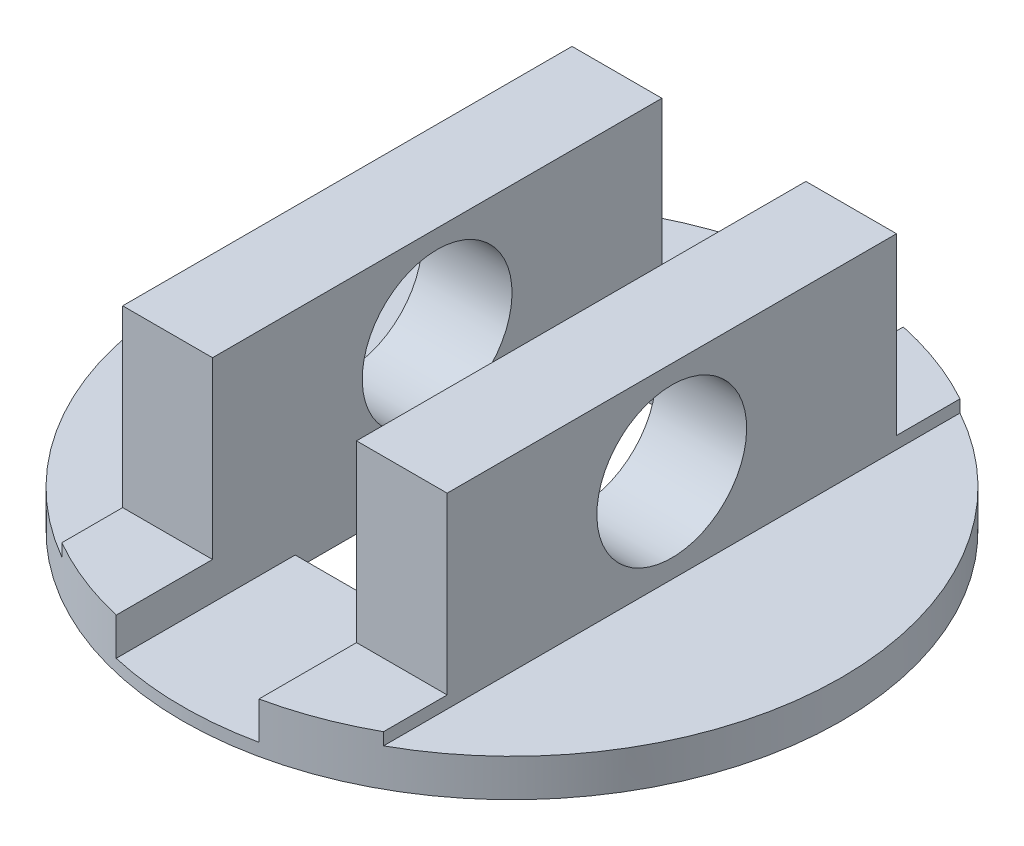
ISO-10303-21;
HEADER;
FILE_DESCRIPTION(('STEP AP214'),'2;1');
FILE_NAME('part.step','',(''),(''),'','','');
FILE_SCHEMA(('AUTOMOTIVE_DESIGN { 1 0 10303 214 1 1 1 1 }'));
ENDSEC;
DATA;
#1=APPLICATION_CONTEXT('core data for automotive mechanical design processes');
#2=APPLICATION_PROTOCOL_DEFINITION('international standard','automotive_design',2000,#1);
#3=PRODUCT_CONTEXT('',#1,'mechanical');
#4=PRODUCT('Part','Part','',(#3));
#5=PRODUCT_RELATED_PRODUCT_CATEGORY('part','',(#4));
#6=PRODUCT_DEFINITION_FORMATION('','',#4);
#7=PRODUCT_DEFINITION_CONTEXT('part definition',#1,'design');
#8=PRODUCT_DEFINITION('design','',#6,#7);
#9=PRODUCT_DEFINITION_SHAPE('','',#8);
#10=(LENGTH_UNIT() NAMED_UNIT(*) SI_UNIT(.MILLI.,.METRE.));
#11=(NAMED_UNIT(*) PLANE_ANGLE_UNIT() SI_UNIT($,.RADIAN.));
#12=(NAMED_UNIT(*) SI_UNIT($,.STERADIAN.) SOLID_ANGLE_UNIT());
#13=UNCERTAINTY_MEASURE_WITH_UNIT(LENGTH_MEASURE(1.E-05),#10,'distance_accuracy_value','');
#14=(GEOMETRIC_REPRESENTATION_CONTEXT(3) GLOBAL_UNCERTAINTY_ASSIGNED_CONTEXT((#13)) GLOBAL_UNIT_ASSIGNED_CONTEXT((#10,
#11,#12)) REPRESENTATION_CONTEXT('',''));
#15=CARTESIAN_POINT('',(0.,0.,0.));
#16=DIRECTION('',(0.,0.,1.));
#17=DIRECTION('',(1.,0.,0.));
#18=AXIS2_PLACEMENT_3D('',#15,#16,#17);
#19=CARTESIAN_POINT('',(0.,90.,0.));
#20=DIRECTION('',(0.,-1.,0.));
#21=DIRECTION('',(0.,0.,-1.));
#22=AXIS2_PLACEMENT_3D('',#19,#20,#21);
#23=CYLINDRICAL_SURFACE('',#22,132.);
#24=CARTESIAN_POINT('',(0.,0.,0.));
#25=DIRECTION('',(0.,1.,0.));
#26=DIRECTION('',(0.,0.,1.));
#27=AXIS2_PLACEMENT_3D('',#24,#25,#26);
#28=CIRCLE('',#27,132.);
#29=CARTESIAN_POINT('',(0.,0.,132.));
#30=VERTEX_POINT('',#29);
#31=EDGE_CURVE('E329',#30,#30,#28,.T.);
#32=ORIENTED_EDGE('',*,*,#31,.T.);
#33=EDGE_LOOP('',(#32));
#34=FACE_BOUND('',#33,.T.);
#35=CARTESIAN_POINT('',(0.,20.,0.));
#36=DIRECTION('',(0.,1.,0.));
#37=DIRECTION('',(0.,0.,1.));
#38=AXIS2_PLACEMENT_3D('',#35,#36,#37);
#39=CIRCLE('',#38,132.);
#40=CARTESIAN_POINT('',(27.6794161373158,20.,129.065293252281));
#41=VERTEX_POINT('',#40);
#42=CARTESIAN_POINT('',(63.9820484445118,20.,115.45690744535));
#43=VERTEX_POINT('',#42);
#44=EDGE_CURVE('E225',#41,#43,#39,.T.);
#45=ORIENTED_EDGE('',*,*,#44,.F.);
#46=DIRECTION('',(0.,-1.,0.));
#47=VECTOR('',#46,1.);
#48=CARTESIAN_POINT('',(27.6794161373158,90.,129.065293252281));
#49=LINE('',#48,#47);
#50=CARTESIAN_POINT('',(27.6794161373158,5.00000000000002,129.065293252281));
#51=VERTEX_POINT('',#50);
#52=EDGE_CURVE('E343',#51,#41,#49,.F.);
#53=ORIENTED_EDGE('',*,*,#52,.F.);
#54=CARTESIAN_POINT('',(0.,5.00000000000002,0.));
#55=DIRECTION('',(0.,-1.,0.));
#56=DIRECTION('',(0.,0.,-1.));
#57=AXIS2_PLACEMENT_3D('',#54,#55,#56);
#58=CIRCLE('',#57,132.);
#59=CARTESIAN_POINT('',(-30.,5.00000000000002,128.545711713771));
#60=VERTEX_POINT('',#59);
#61=EDGE_CURVE('E316',#51,#60,#58,.T.);
#62=ORIENTED_EDGE('',*,*,#61,.T.);
#63=DIRECTION('',(0.,-1.,0.));
#64=VECTOR('',#63,1.);
#65=CARTESIAN_POINT('',(-30.,90.,128.545711713771));
#66=LINE('',#65,#64);
#67=CARTESIAN_POINT('',(-30.,20.,128.545711713771));
#68=VERTEX_POINT('',#67);
#69=EDGE_CURVE('E336',#60,#68,#66,.F.);
#70=ORIENTED_EDGE('',*,*,#69,.T.);
#71=CARTESIAN_POINT('',(-66.,20.,114.315353299546));
#72=VERTEX_POINT('',#71);
#73=EDGE_CURVE('E208',#72,#68,#39,.T.);
#74=ORIENTED_EDGE('',*,*,#73,.F.);
#75=DIRECTION('',(0.,-1.,0.));
#76=VECTOR('',#75,1.);
#77=CARTESIAN_POINT('',(-66.,90.,114.315353299546));
#78=LINE('',#77,#76);
#79=CARTESIAN_POINT('',(-66.,15.,114.315353299546));
#80=VERTEX_POINT('',#79);
#81=EDGE_CURVE('E206',#80,#72,#78,.F.);
#82=ORIENTED_EDGE('',*,*,#81,.F.);
#83=CARTESIAN_POINT('',(0.,15.,0.));
#84=DIRECTION('',(0.,1.,0.));
#85=DIRECTION('',(0.,0.,1.));
#86=AXIS2_PLACEMENT_3D('',#83,#84,#85);
#87=CIRCLE('',#86,132.);
#88=CARTESIAN_POINT('',(-66.,15.,-114.315353299546));
#89=VERTEX_POINT('',#88);
#90=EDGE_CURVE('E292',#89,#80,#87,.T.);
#91=ORIENTED_EDGE('',*,*,#90,.F.);
#92=DIRECTION('',(0.,-1.,0.));
#93=VECTOR('',#92,1.);
#94=CARTESIAN_POINT('',(-66.,90.,-114.315353299546));
#95=LINE('',#94,#93);
#96=CARTESIAN_POINT('',(-66.,20.,-114.315353299546));
#97=VERTEX_POINT('',#96);
#98=EDGE_CURVE('E356',#97,#89,#95,.T.);
#99=ORIENTED_EDGE('',*,*,#98,.F.);
#100=CARTESIAN_POINT('',(-30.,20.,-128.545711713771));
#101=VERTEX_POINT('',#100);
#102=EDGE_CURVE('E215',#101,#97,#39,.T.);
#103=ORIENTED_EDGE('',*,*,#102,.F.);
#104=DIRECTION('',(0.,-1.,0.));
#105=VECTOR('',#104,1.);
#106=CARTESIAN_POINT('',(-30.,90.,-128.545711713771));
#107=LINE('',#106,#105);
#108=CARTESIAN_POINT('',(-30.,5.00000000000002,-128.545711713771));
#109=VERTEX_POINT('',#108);
#110=EDGE_CURVE('E333',#101,#109,#107,.T.);
#111=ORIENTED_EDGE('',*,*,#110,.T.);
#112=CARTESIAN_POINT('',(27.6794161373158,5.00000000000002,-129.065293252281));
#113=VERTEX_POINT('',#112);
#114=EDGE_CURVE('E317',#109,#113,#58,.T.);
#115=ORIENTED_EDGE('',*,*,#114,.T.);
#116=DIRECTION('',(0.,-1.,0.));
#117=VECTOR('',#116,1.);
#118=CARTESIAN_POINT('',(27.6794161373158,90.,-129.065293252281));
#119=LINE('',#118,#117);
#120=CARTESIAN_POINT('',(27.6794161373158,20.,-129.065293252281));
#121=VERTEX_POINT('',#120);
#122=EDGE_CURVE('E340',#121,#113,#119,.T.);
#123=ORIENTED_EDGE('',*,*,#122,.F.);
#124=CARTESIAN_POINT('',(63.9820484445118,20.,-115.45690744535));
#125=VERTEX_POINT('',#124);
#126=EDGE_CURVE('E216',#125,#121,#39,.T.);
#127=ORIENTED_EDGE('',*,*,#126,.F.);
#128=DIRECTION('',(0.,-1.,0.));
#129=VECTOR('',#128,1.);
#130=CARTESIAN_POINT('',(63.9820484445118,90.,-115.45690744535));
#131=LINE('',#130,#129);
#132=CARTESIAN_POINT('',(63.9820484445118,15.0746365795195,-115.45690744535));
#133=VERTEX_POINT('',#132);
#134=EDGE_CURVE('E295',#125,#133,#131,.T.);
#135=ORIENTED_EDGE('',*,*,#134,.T.);
#136=CARTESIAN_POINT('',(0.,15.0746365795195,0.));
#137=DIRECTION('',(0.,-1.,0.));
#138=DIRECTION('',(0.,0.,-1.));
#139=AXIS2_PLACEMENT_3D('',#136,#137,#138);
#140=CIRCLE('',#139,132.);
#141=CARTESIAN_POINT('',(63.9820484445118,15.0746365795195,115.45690744535));
#142=VERTEX_POINT('',#141);
#143=EDGE_CURVE('E309',#133,#142,#140,.T.);
#144=ORIENTED_EDGE('',*,*,#143,.T.);
#145=DIRECTION('',(0.,-1.,0.));
#146=VECTOR('',#145,1.);
#147=CARTESIAN_POINT('',(63.9820484445118,90.,115.45690744535));
#148=LINE('',#147,#146);
#149=EDGE_CURVE('E306',#142,#43,#148,.F.);
#150=ORIENTED_EDGE('',*,*,#149,.T.);
#151=EDGE_LOOP('',(#45,#53,#62,#70,#74,#82,#91,#99,#103,#111,#115,#123,#127,#135,#144,#150));
#152=FACE_BOUND('',#151,.T.);
#153=ADVANCED_FACE('F45',(#34,#152),#23,.T.);
#154=CARTESIAN_POINT('',(0.,90.,0.));
#155=DIRECTION('',(0.,1.,0.));
#156=DIRECTION('',(0.,0.,1.));
#157=AXIS2_PLACEMENT_3D('',#154,#155,#156);
#158=PLANE('',#157);
#159=DIRECTION('',(0.,0.,1.));
#160=VECTOR('',#159,1.);
#161=CARTESIAN_POINT('',(-30.,90.,0.));
#162=LINE('',#161,#160);
#163=CARTESIAN_POINT('',(-30.,90.,-90.0396039070107));
#164=VERTEX_POINT('',#163);
#165=CARTESIAN_POINT('',(-30.,90.,89.9603960929893));
#166=VERTEX_POINT('',#165);
#167=EDGE_CURVE('E321',#164,#166,#162,.T.);
#168=ORIENTED_EDGE('',*,*,#167,.F.);
#169=DIRECTION('',(-1.,0.,0.));
#170=VECTOR('',#169,1.);
#171=CARTESIAN_POINT('',(0.,90.,-90.0396039070107));
#172=LINE('',#171,#170);
#173=CARTESIAN_POINT('',(-66.,90.,-90.0396039070107));
#174=VERTEX_POINT('',#173);
#175=EDGE_CURVE('E241',#164,#174,#172,.T.);
#176=ORIENTED_EDGE('',*,*,#175,.T.);
#177=DIRECTION('',(0.,0.,1.));
#178=VECTOR('',#177,1.);
#179=CARTESIAN_POINT('',(-66.,90.,0.));
#180=LINE('',#179,#178);
#181=CARTESIAN_POINT('',(-66.,90.,89.9603960929893));
#182=VERTEX_POINT('',#181);
#183=EDGE_CURVE('E313',#174,#182,#180,.T.);
#184=ORIENTED_EDGE('',*,*,#183,.T.);
#185=DIRECTION('',(1.,0.,0.));
#186=VECTOR('',#185,1.);
#187=CARTESIAN_POINT('',(0.,90.,89.9603960929893));
#188=LINE('',#187,#186);
#189=EDGE_CURVE('E69',#182,#166,#188,.T.);
#190=ORIENTED_EDGE('',*,*,#189,.T.);
#191=EDGE_LOOP('',(#168,#176,#184,#190));
#192=FACE_BOUND('',#191,.T.);
#193=ADVANCED_FACE('F436',(#192),#158,.T.);
#194=DIRECTION('',(0.,0.,1.));
#195=VECTOR('',#194,1.);
#196=CARTESIAN_POINT('',(63.9820484445118,90.,-160.));
#197=LINE('',#196,#195);
#198=CARTESIAN_POINT('',(63.9820484445118,90.,-90.0396039070107));
#199=VERTEX_POINT('',#198);
#200=CARTESIAN_POINT('',(63.9820484445118,90.,89.9603960929893));
#201=VERTEX_POINT('',#200);
#202=EDGE_CURVE('E290',#199,#201,#197,.T.);
#203=ORIENTED_EDGE('',*,*,#202,.F.);
#204=DIRECTION('',(-1.,0.,0.));
#205=VECTOR('',#204,1.);
#206=CARTESIAN_POINT('',(0.,90.,-90.0396039070107));
#207=LINE('',#206,#205);
#208=CARTESIAN_POINT('',(27.6794161373158,90.,-90.0396039070107));
#209=VERTEX_POINT('',#208);
#210=EDGE_CURVE('E253',#199,#209,#207,.T.);
#211=ORIENTED_EDGE('',*,*,#210,.T.);
#212=DIRECTION('',(0.,0.,1.));
#213=VECTOR('',#212,1.);
#214=CARTESIAN_POINT('',(27.6794161373158,90.,0.));
#215=LINE('',#214,#213);
#216=CARTESIAN_POINT('',(27.6794161373158,90.,89.9603960929893));
#217=VERTEX_POINT('',#216);
#218=EDGE_CURVE('E325',#209,#217,#215,.T.);
#219=ORIENTED_EDGE('',*,*,#218,.T.);
#220=DIRECTION('',(1.,0.,0.));
#221=VECTOR('',#220,1.);
#222=CARTESIAN_POINT('',(0.,90.,89.9603960929893));
#223=LINE('',#222,#221);
#224=EDGE_CURVE('E264',#217,#201,#223,.T.);
#225=ORIENTED_EDGE('',*,*,#224,.T.);
#226=EDGE_LOOP('',(#203,#211,#219,#225));
#227=FACE_BOUND('',#226,.T.);
#228=ADVANCED_FACE('F473',(#227),#158,.T.);
#229=CARTESIAN_POINT('',(-30.,90.,-160.));
#230=DIRECTION('',(-1.,0.,0.));
#231=DIRECTION('',(0.,-1.,0.));
#232=AXIS2_PLACEMENT_3D('',#229,#230,#231);
#233=PLANE('',#232);
#234=CARTESIAN_POINT('',(-30.,52.5373182897597,0.));
#235=DIRECTION('',(-1.,0.,0.));
#236=DIRECTION('',(0.,-1.,0.));
#237=AXIS2_PLACEMENT_3D('',#234,#235,#236);
#238=CIRCLE('',#237,30.);
#239=CARTESIAN_POINT('',(-30.,82.5373182897597,0.));
#240=VERTEX_POINT('',#239);
#241=EDGE_CURVE('E365',#240,#240,#238,.T.);
#242=ORIENTED_EDGE('',*,*,#241,.T.);
#243=EDGE_LOOP('',(#242));
#244=FACE_BOUND('',#243,.T.);
#245=DIRECTION('',(0.,0.,-1.));
#246=VECTOR('',#245,1.);
#247=CARTESIAN_POINT('',(-30.,20.,-160.));
#248=LINE('',#247,#246);
#249=CARTESIAN_POINT('',(-30.,20.,-90.0396039070107));
#250=VERTEX_POINT('',#249);
#251=EDGE_CURVE('E209',#250,#101,#248,.T.);
#252=ORIENTED_EDGE('',*,*,#251,.F.);
#253=DIRECTION('',(0.,-1.,0.));
#254=VECTOR('',#253,1.);
#255=CARTESIAN_POINT('',(-30.,90.,-90.0396039070107));
#256=LINE('',#255,#254);
#257=EDGE_CURVE('E237',#164,#250,#256,.T.);
#258=ORIENTED_EDGE('',*,*,#257,.F.);
#259=ORIENTED_EDGE('',*,*,#167,.T.);
#260=DIRECTION('',(0.,1.,0.));
#261=VECTOR('',#260,1.);
#262=CARTESIAN_POINT('',(-30.,90.,89.9603960929893));
#263=LINE('',#262,#261);
#264=CARTESIAN_POINT('',(-30.,20.,89.9603960929893));
#265=VERTEX_POINT('',#264);
#266=EDGE_CURVE('E257',#265,#166,#263,.T.);
#267=ORIENTED_EDGE('',*,*,#266,.F.);
#268=EDGE_CURVE('E197',#68,#265,#248,.T.);
#269=ORIENTED_EDGE('',*,*,#268,.F.);
#270=ORIENTED_EDGE('',*,*,#69,.F.);
#271=DIRECTION('',(0.,0.,1.));
#272=VECTOR('',#271,1.);
#273=CARTESIAN_POINT('',(-30.,5.00000000000002,-160.));
#274=LINE('',#273,#272);
#275=CARTESIAN_POINT('',(-30.,5.00000000000002,56.8649181526918));
#276=VERTEX_POINT('',#275);
#277=EDGE_CURVE('E352',#276,#60,#274,.T.);
#278=ORIENTED_EDGE('',*,*,#277,.F.);
#279=DIRECTION('',(0.,1.,0.));
#280=VECTOR('',#279,1.);
#281=CARTESIAN_POINT('',(-30.,-155.,56.8649181526918));
#282=LINE('',#281,#280);
#283=CARTESIAN_POINT('',(-30.,0.,56.8649181526918));
#284=VERTEX_POINT('',#283);
#285=EDGE_CURVE('E404',#284,#276,#282,.T.);
#286=ORIENTED_EDGE('',*,*,#285,.F.);
#287=DIRECTION('',(0.,0.,1.));
#288=VECTOR('',#287,1.);
#289=CARTESIAN_POINT('',(-30.,0.,0.));
#290=LINE('',#289,#288);
#291=CARTESIAN_POINT('',(-30.,0.,-71.7900935208518));
#292=VERTEX_POINT('',#291);
#293=EDGE_CURVE('E399',#292,#284,#290,.T.);
#294=ORIENTED_EDGE('',*,*,#293,.F.);
#295=DIRECTION('',(0.,1.,0.));
#296=VECTOR('',#295,1.);
#297=CARTESIAN_POINT('',(-30.,-155.,-71.7900935208518));
#298=LINE('',#297,#296);
#299=CARTESIAN_POINT('',(-30.,4.99999999999995,-71.7900935208518));
#300=VERTEX_POINT('',#299);
#301=EDGE_CURVE('E403',#292,#300,#298,.T.);
#302=ORIENTED_EDGE('',*,*,#301,.T.);
#303=EDGE_CURVE('E347',#109,#300,#274,.T.);
#304=ORIENTED_EDGE('',*,*,#303,.F.);
#305=ORIENTED_EDGE('',*,*,#110,.F.);
#306=EDGE_LOOP('',(#252,#258,#259,#267,#269,#270,#278,#286,#294,#302,#304,#305));
#307=FACE_BOUND('',#306,.T.);
#308=ADVANCED_FACE('F420',(#244,#307),#233,.F.);
#309=CARTESIAN_POINT('',(27.6794161373158,90.,-160.));
#310=DIRECTION('',(-1.,0.,0.));
#311=DIRECTION('',(0.,-1.,0.));
#312=AXIS2_PLACEMENT_3D('',#309,#310,#311);
#313=PLANE('',#312);
#314=CARTESIAN_POINT('',(27.6794161373158,52.5373182897597,0.));
#315=DIRECTION('',(-1.,0.,0.));
#316=DIRECTION('',(0.,-1.,0.));
#317=AXIS2_PLACEMENT_3D('',#314,#315,#316);
#318=CIRCLE('',#317,30.);
#319=CARTESIAN_POINT('',(27.6794161373158,82.5373182897597,0.));
#320=VERTEX_POINT('',#319);
#321=EDGE_CURVE('E373',#320,#320,#318,.T.);
#322=ORIENTED_EDGE('',*,*,#321,.F.);
#323=EDGE_LOOP('',(#322));
#324=FACE_BOUND('',#323,.T.);
#325=DIRECTION('',(0.,-1.,0.));
#326=VECTOR('',#325,1.);
#327=CARTESIAN_POINT('',(27.6794161373158,90.,-90.0396039070107));
#328=LINE('',#327,#326);
#329=CARTESIAN_POINT('',(27.6794161373158,20.,-90.0396039070107));
#330=VERTEX_POINT('',#329);
#331=EDGE_CURVE('E250',#209,#330,#328,.T.);
#332=ORIENTED_EDGE('',*,*,#331,.T.);
#333=DIRECTION('',(0.,0.,-1.));
#334=VECTOR('',#333,1.);
#335=CARTESIAN_POINT('',(27.6794161373158,20.,-160.));
#336=LINE('',#335,#334);
#337=EDGE_CURVE('E227',#330,#121,#336,.T.);
#338=ORIENTED_EDGE('',*,*,#337,.T.);
#339=ORIENTED_EDGE('',*,*,#122,.T.);
#340=DIRECTION('',(0.,0.,1.));
#341=VECTOR('',#340,1.);
#342=CARTESIAN_POINT('',(27.6794161373158,5.00000000000002,-160.));
#343=LINE('',#342,#341);
#344=CARTESIAN_POINT('',(27.6794161373158,4.99999999999995,-71.7900935208518));
#345=VERTEX_POINT('',#344);
#346=EDGE_CURVE('E346',#113,#345,#343,.T.);
#347=ORIENTED_EDGE('',*,*,#346,.T.);
#348=DIRECTION('',(0.,1.,0.));
#349=VECTOR('',#348,1.);
#350=CARTESIAN_POINT('',(27.6794161373158,-155.,-71.7900935208518));
#351=LINE('',#350,#349);
#352=CARTESIAN_POINT('',(27.6794161373158,0.,-71.7900935208518));
#353=VERTEX_POINT('',#352);
#354=EDGE_CURVE('E411',#353,#345,#351,.T.);
#355=ORIENTED_EDGE('',*,*,#354,.F.);
#356=DIRECTION('',(0.,0.,-1.));
#357=VECTOR('',#356,1.);
#358=CARTESIAN_POINT('',(27.6794161373158,0.,0.));
#359=LINE('',#358,#357);
#360=CARTESIAN_POINT('',(27.6794161373158,0.,56.8649181526918));
#361=VERTEX_POINT('',#360);
#362=EDGE_CURVE('E395',#361,#353,#359,.T.);
#363=ORIENTED_EDGE('',*,*,#362,.F.);
#364=DIRECTION('',(0.,1.,0.));
#365=VECTOR('',#364,1.);
#366=CARTESIAN_POINT('',(27.6794161373158,-155.,56.8649181526918));
#367=LINE('',#366,#365);
#368=CARTESIAN_POINT('',(27.6794161373158,4.99999999999995,56.8649181526918));
#369=VERTEX_POINT('',#368);
#370=EDGE_CURVE('E407',#361,#369,#367,.T.);
#371=ORIENTED_EDGE('',*,*,#370,.T.);
#372=EDGE_CURVE('E351',#369,#51,#343,.T.);
#373=ORIENTED_EDGE('',*,*,#372,.T.);
#374=ORIENTED_EDGE('',*,*,#52,.T.);
#375=CARTESIAN_POINT('',(27.6794161373158,20.,89.9603960929893));
#376=VERTEX_POINT('',#375);
#377=EDGE_CURVE('E221',#41,#376,#336,.T.);
#378=ORIENTED_EDGE('',*,*,#377,.T.);
#379=DIRECTION('',(0.,1.,0.));
#380=VECTOR('',#379,1.);
#381=CARTESIAN_POINT('',(27.6794161373158,90.,89.9603960929893));
#382=LINE('',#381,#380);
#383=EDGE_CURVE('E190',#376,#217,#382,.T.);
#384=ORIENTED_EDGE('',*,*,#383,.T.);
#385=ORIENTED_EDGE('',*,*,#218,.F.);
#386=EDGE_LOOP('',(#332,#338,#339,#347,#355,#363,#371,#373,#374,#378,#384,#385));
#387=FACE_BOUND('',#386,.T.);
#388=ADVANCED_FACE('F456',(#324,#387),#313,.T.);
#389=CARTESIAN_POINT('',(-66.,90.,-160.));
#390=DIRECTION('',(-1.,0.,0.));
#391=DIRECTION('',(0.,0.,1.));
#392=AXIS2_PLACEMENT_3D('',#389,#390,#391);
#393=PLANE('',#392);
#394=CARTESIAN_POINT('',(-66.,52.5373182897597,0.));
#395=DIRECTION('',(-1.,0.,0.));
#396=DIRECTION('',(0.,0.,1.));
#397=AXIS2_PLACEMENT_3D('',#394,#395,#396);
#398=CIRCLE('',#397,30.);
#399=CARTESIAN_POINT('',(-66.,82.5373182897597,0.));
#400=VERTEX_POINT('',#399);
#401=EDGE_CURVE('E301',#400,#400,#398,.T.);
#402=ORIENTED_EDGE('',*,*,#401,.F.);
#403=EDGE_LOOP('',(#402));
#404=FACE_BOUND('',#403,.T.);
#405=DIRECTION('',(0.,-1.,0.));
#406=VECTOR('',#405,1.);
#407=CARTESIAN_POINT('',(-66.,90.,-90.0396039070107));
#408=LINE('',#407,#406);
#409=CARTESIAN_POINT('',(-66.,20.,-90.0396039070107));
#410=VERTEX_POINT('',#409);
#411=EDGE_CURVE('E247',#174,#410,#408,.T.);
#412=ORIENTED_EDGE('',*,*,#411,.T.);
#413=DIRECTION('',(0.,0.,-1.));
#414=VECTOR('',#413,1.);
#415=CARTESIAN_POINT('',(-66.,20.,-160.));
#416=LINE('',#415,#414);
#417=EDGE_CURVE('E211',#410,#97,#416,.T.);
#418=ORIENTED_EDGE('',*,*,#417,.T.);
#419=ORIENTED_EDGE('',*,*,#98,.T.);
#420=DIRECTION('',(0.,0.,1.));
#421=VECTOR('',#420,1.);
#422=CARTESIAN_POINT('',(-66.,15.,-160.));
#423=LINE('',#422,#421);
#424=EDGE_CURVE('E361',#89,#80,#423,.T.);
#425=ORIENTED_EDGE('',*,*,#424,.T.);
#426=ORIENTED_EDGE('',*,*,#81,.T.);
#427=CARTESIAN_POINT('',(-66.,20.,89.9603960929893));
#428=VERTEX_POINT('',#427);
#429=EDGE_CURVE('E194',#72,#428,#416,.T.);
#430=ORIENTED_EDGE('',*,*,#429,.T.);
#431=DIRECTION('',(0.,1.,0.));
#432=VECTOR('',#431,1.);
#433=CARTESIAN_POINT('',(-66.,90.,89.9603960929893));
#434=LINE('',#433,#432);
#435=EDGE_CURVE('E180',#428,#182,#434,.T.);
#436=ORIENTED_EDGE('',*,*,#435,.T.);
#437=ORIENTED_EDGE('',*,*,#183,.F.);
#438=EDGE_LOOP('',(#412,#418,#419,#425,#426,#430,#436,#437));
#439=FACE_BOUND('',#438,.T.);
#440=ADVANCED_FACE('F203',(#404,#439),#393,.T.);
#441=CARTESIAN_POINT('',(63.9820484445118,90.,-160.));
#442=DIRECTION('',(-1.,0.,0.));
#443=DIRECTION('',(0.,-1.,0.));
#444=AXIS2_PLACEMENT_3D('',#441,#442,#443);
#445=PLANE('',#444);
#446=CARTESIAN_POINT('',(63.9820484445118,52.5373182897597,0.));
#447=DIRECTION('',(-1.,0.,0.));
#448=DIRECTION('',(0.,-1.,0.));
#449=AXIS2_PLACEMENT_3D('',#446,#447,#448);
#450=CIRCLE('',#449,30.);
#451=CARTESIAN_POINT('',(63.9820484445117,82.5373182897597,0.));
#452=VERTEX_POINT('',#451);
#453=EDGE_CURVE('E298',#452,#452,#450,.T.);
#454=ORIENTED_EDGE('',*,*,#453,.T.);
#455=EDGE_LOOP('',(#454));
#456=FACE_BOUND('',#455,.T.);
#457=DIRECTION('',(0.,0.,-1.));
#458=VECTOR('',#457,1.);
#459=CARTESIAN_POINT('',(63.9820484445118,20.,-160.));
#460=LINE('',#459,#458);
#461=CARTESIAN_POINT('',(63.9820484445118,20.,-90.0396039070107));
#462=VERTEX_POINT('',#461);
#463=EDGE_CURVE('E12',#462,#125,#460,.T.);
#464=ORIENTED_EDGE('',*,*,#463,.F.);
#465=DIRECTION('',(0.,-1.,0.));
#466=VECTOR('',#465,1.);
#467=CARTESIAN_POINT('',(63.9820484445118,90.,-90.0396039070107));
#468=LINE('',#467,#466);
#469=EDGE_CURVE('E48',#199,#462,#468,.T.);
#470=ORIENTED_EDGE('',*,*,#469,.F.);
#471=ORIENTED_EDGE('',*,*,#202,.T.);
#472=DIRECTION('',(0.,1.,0.));
#473=VECTOR('',#472,1.);
#474=CARTESIAN_POINT('',(63.9820484445118,90.,89.9603960929893));
#475=LINE('',#474,#473);
#476=CARTESIAN_POINT('',(63.9820484445118,20.,89.9603960929893));
#477=VERTEX_POINT('',#476);
#478=EDGE_CURVE('E276',#477,#201,#475,.T.);
#479=ORIENTED_EDGE('',*,*,#478,.F.);
#480=EDGE_CURVE('E54',#43,#477,#460,.T.);
#481=ORIENTED_EDGE('',*,*,#480,.F.);
#482=ORIENTED_EDGE('',*,*,#149,.F.);
#483=DIRECTION('',(0.,0.,1.));
#484=VECTOR('',#483,1.);
#485=CARTESIAN_POINT('',(63.9820484445118,15.0746365795195,-160.));
#486=LINE('',#485,#484);
#487=EDGE_CURVE('E364',#133,#142,#486,.T.);
#488=ORIENTED_EDGE('',*,*,#487,.F.);
#489=ORIENTED_EDGE('',*,*,#134,.F.);
#490=EDGE_LOOP('',(#464,#470,#471,#479,#481,#482,#488,#489));
#491=FACE_BOUND('',#490,.T.);
#492=ADVANCED_FACE('F287',(#456,#491),#445,.F.);
#493=CARTESIAN_POINT('',(-30.,5.00000000000002,-160.));
#494=DIRECTION('',(0.,-1.,0.));
#495=DIRECTION('',(0.,0.,-1.));
#496=AXIS2_PLACEMENT_3D('',#493,#494,#495);
#497=PLANE('',#496);
#498=ORIENTED_EDGE('',*,*,#303,.T.);
#499=DIRECTION('',(1.,0.,0.));
#500=VECTOR('',#499,1.);
#501=CARTESIAN_POINT('',(-30.,5.00000000000002,-71.7900935208518));
#502=LINE('',#501,#500);
#503=EDGE_CURVE('E383',#300,#345,#502,.T.);
#504=ORIENTED_EDGE('',*,*,#503,.T.);
#505=ORIENTED_EDGE('',*,*,#346,.F.);
#506=ORIENTED_EDGE('',*,*,#114,.F.);
#507=EDGE_LOOP('',(#498,#504,#505,#506));
#508=FACE_BOUND('',#507,.T.);
#509=ADVANCED_FACE('F426',(#508),#497,.F.);
#510=CARTESIAN_POINT('',(0.,0.,0.));
#511=DIRECTION('',(0.,1.,0.));
#512=DIRECTION('',(0.,0.,1.));
#513=AXIS2_PLACEMENT_3D('',#510,#511,#512);
#514=PLANE('',#513);
#515=DIRECTION('',(-1.,0.,0.));
#516=VECTOR('',#515,1.);
#517=CARTESIAN_POINT('',(0.,0.,-71.7900935208518));
#518=LINE('',#517,#516);
#519=EDGE_CURVE('E302',#353,#292,#518,.T.);
#520=ORIENTED_EDGE('',*,*,#519,.T.);
#521=ORIENTED_EDGE('',*,*,#293,.T.);
#522=DIRECTION('',(1.,0.,0.));
#523=VECTOR('',#522,1.);
#524=CARTESIAN_POINT('',(0.,0.,56.8649181526918));
#525=LINE('',#524,#523);
#526=EDGE_CURVE('E387',#284,#361,#525,.T.);
#527=ORIENTED_EDGE('',*,*,#526,.T.);
#528=ORIENTED_EDGE('',*,*,#362,.T.);
#529=EDGE_LOOP('',(#520,#521,#527,#528));
#530=FACE_BOUND('',#529,.T.);
#531=ORIENTED_EDGE('',*,*,#31,.F.);
#532=EDGE_LOOP('',(#531));
#533=FACE_BOUND('',#532,.T.);
#534=ADVANCED_FACE('F451',(#530,#533),#514,.F.);
#535=ORIENTED_EDGE('',*,*,#372,.F.);
#536=DIRECTION('',(-1.,0.,0.));
#537=VECTOR('',#536,1.);
#538=CARTESIAN_POINT('',(-30.,5.00000000000002,56.8649181526918));
#539=LINE('',#538,#537);
#540=EDGE_CURVE('E391',#369,#276,#539,.T.);
#541=ORIENTED_EDGE('',*,*,#540,.T.);
#542=ORIENTED_EDGE('',*,*,#277,.T.);
#543=ORIENTED_EDGE('',*,*,#61,.F.);
#544=EDGE_LOOP('',(#535,#541,#542,#543));
#545=FACE_BOUND('',#544,.T.);
#546=ADVANCED_FACE('F448',(#545),#497,.F.);
#547=CARTESIAN_POINT('',(-66.,15.,-160.));
#548=DIRECTION('',(0.,1.,0.));
#549=DIRECTION('',(0.,0.,1.));
#550=AXIS2_PLACEMENT_3D('',#547,#548,#549);
#551=PLANE('',#550);
#552=ORIENTED_EDGE('',*,*,#424,.F.);
#553=ORIENTED_EDGE('',*,*,#90,.T.);
#554=EDGE_LOOP('',(#552,#553));
#555=FACE_BOUND('',#554,.T.);
#556=ADVANCED_FACE('F481',(#555),#551,.T.);
#557=CARTESIAN_POINT('',(63.9820484445118,15.0746365795195,-160.));
#558=DIRECTION('',(0.,-1.,0.));
#559=DIRECTION('',(0.,0.,-1.));
#560=AXIS2_PLACEMENT_3D('',#557,#558,#559);
#561=PLANE('',#560);
#562=ORIENTED_EDGE('',*,*,#487,.T.);
#563=ORIENTED_EDGE('',*,*,#143,.F.);
#564=EDGE_LOOP('',(#562,#563));
#565=FACE_BOUND('',#564,.T.);
#566=ADVANCED_FACE('F490',(#565),#561,.F.);
#567=CARTESIAN_POINT('',(-96.0179515554883,52.5373182897597,0.));
#568=DIRECTION('',(1.,0.,0.));
#569=DIRECTION('',(0.,1.,0.));
#570=AXIS2_PLACEMENT_3D('',#567,#568,#569);
#571=CYLINDRICAL_SURFACE('',#570,30.);
#572=CARTESIAN_POINT('',(27.6794161373158,82.5373182897597,0.));
#573=CARTESIAN_POINT('',(28.0575685571824,82.5373182897597,0.));
#574=CARTESIAN_POINT('',(28.4357209770491,82.5373182897597,0.));
#575=CARTESIAN_POINT('',(29.1920258167823,82.5373182897597,0.));
#576=CARTESIAN_POINT('',(29.5701782366489,82.5373182897597,0.));
#577=CARTESIAN_POINT('',(30.3264830763822,82.5373182897597,0.));
#578=CARTESIAN_POINT('',(30.7046354962488,82.5373182897597,0.));
#579=CARTESIAN_POINT('',(31.4609403359821,82.5373182897597,0.));
#580=CARTESIAN_POINT('',(31.8390927558487,82.5373182897597,0.));
#581=CARTESIAN_POINT('',(32.5953975955819,82.5373182897597,0.));
#582=CARTESIAN_POINT('',(32.9735500154486,82.5373182897597,0.));
#583=CARTESIAN_POINT('',(33.7298548551818,82.5373182897597,0.));
#584=CARTESIAN_POINT('',(34.1080072750484,82.5373182897597,0.));
#585=CARTESIAN_POINT('',(34.8643121147817,82.5373182897597,0.));
#586=CARTESIAN_POINT('',(35.2424645346483,82.5373182897597,0.));
#587=CARTESIAN_POINT('',(35.9987693743816,82.5373182897597,0.));
#588=CARTESIAN_POINT('',(36.3769217942482,82.5373182897597,0.));
#589=CARTESIAN_POINT('',(37.1332266339814,82.5373182897597,0.));
#590=CARTESIAN_POINT('',(37.511379053848,82.5373182897597,0.));
#591=CARTESIAN_POINT('',(38.2676838935813,82.5373182897597,0.));
#592=CARTESIAN_POINT('',(38.6458363134479,82.5373182897597,0.));
#593=CARTESIAN_POINT('',(39.4021411531812,82.5373182897597,0.));
#594=CARTESIAN_POINT('',(39.7802935730478,82.5373182897597,0.));
#595=CARTESIAN_POINT('',(40.536598412781,82.5373182897597,0.));
#596=CARTESIAN_POINT('',(40.9147508326477,82.5373182897597,0.));
#597=CARTESIAN_POINT('',(41.6710556723809,82.5373182897597,0.));
#598=CARTESIAN_POINT('',(42.0492080922475,82.5373182897597,0.));
#599=CARTESIAN_POINT('',(42.8055129319808,82.5373182897597,0.));
#600=CARTESIAN_POINT('',(43.1836653518474,82.5373182897597,0.));
#601=CARTESIAN_POINT('',(43.9399701915807,82.5373182897597,0.));
#602=CARTESIAN_POINT('',(44.3181226114473,82.5373182897597,0.));
#603=CARTESIAN_POINT('',(45.0744274511805,82.5373182897597,0.));
#604=CARTESIAN_POINT('',(45.4525798710471,82.5373182897597,0.));
#605=CARTESIAN_POINT('',(46.2088847107804,82.5373182897597,0.));
#606=CARTESIAN_POINT('',(46.587037130647,82.5373182897597,0.));
#607=CARTESIAN_POINT('',(47.3433419703803,82.5373182897597,0.));
#608=CARTESIAN_POINT('',(47.7214943902469,82.5373182897597,0.));
#609=CARTESIAN_POINT('',(48.4777992299802,82.5373182897597,0.));
#610=CARTESIAN_POINT('',(48.8559516498468,82.5373182897597,0.));
#611=CARTESIAN_POINT('',(49.61225648958,82.5373182897597,0.));
#612=CARTESIAN_POINT('',(49.9904089094466,82.5373182897597,0.));
#613=CARTESIAN_POINT('',(50.7467137491799,82.5373182897597,0.));
#614=CARTESIAN_POINT('',(51.1248661690465,82.5373182897597,0.));
#615=CARTESIAN_POINT('',(51.8811710087798,82.5373182897597,0.));
#616=CARTESIAN_POINT('',(52.2593234286464,82.5373182897597,0.));
#617=CARTESIAN_POINT('',(53.0156282683796,82.5373182897597,0.));
#618=CARTESIAN_POINT('',(53.3937806882463,82.5373182897597,0.));
#619=CARTESIAN_POINT('',(54.1500855279795,82.5373182897597,0.));
#620=CARTESIAN_POINT('',(54.5282379478461,82.5373182897597,0.));
#621=CARTESIAN_POINT('',(55.2845427875794,82.5373182897597,0.));
#622=CARTESIAN_POINT('',(55.662695207446,82.5373182897597,0.));
#623=CARTESIAN_POINT('',(56.4190000471793,82.5373182897597,0.));
#624=CARTESIAN_POINT('',(56.7971524670459,82.5373182897597,0.));
#625=CARTESIAN_POINT('',(57.5534573067791,82.5373182897597,0.));
#626=CARTESIAN_POINT('',(57.9316097266457,82.5373182897597,0.));
#627=CARTESIAN_POINT('',(58.687914566379,82.5373182897597,0.));
#628=CARTESIAN_POINT('',(59.0660669862456,82.5373182897597,0.));
#629=CARTESIAN_POINT('',(59.8223718259789,82.5373182897597,0.));
#630=CARTESIAN_POINT('',(60.2005242458455,82.5373182897597,0.));
#631=CARTESIAN_POINT('',(60.9568290855787,82.5373182897597,0.));
#632=CARTESIAN_POINT('',(61.3349815054454,82.5373182897597,0.));
#633=CARTESIAN_POINT('',(62.0912863451786,82.5373182897597,0.));
#634=CARTESIAN_POINT('',(62.4694387650452,82.5373182897597,0.));
#635=CARTESIAN_POINT('',(63.2257436047785,82.5373182897597,0.));
#636=CARTESIAN_POINT('',(63.6038960246451,82.5373182897597,0.));
#637=CARTESIAN_POINT('',(63.9820484445117,82.5373182897597,0.));
#638=B_SPLINE_CURVE_WITH_KNOTS('',3,(#572,#573,#574,#575,#576,#577,#578,#579,#580,#581,#582,
#583,#584,#585,#586,#587,#588,#589,#590,#591,#592,#593,#594,#595,#596,#597,#598,#599,#600,#601,
#602,#603,#604,#605,#606,#607,#608,#609,#610,#611,#612,#613,#614,#615,#616,#617,#618,#619,#620,
#621,#622,#623,#624,#625,#626,#627,#628,#629,#630,#631,#632,#633,#634,#635,#636,#637),
.UNSPECIFIED.,.F.,.F.,(4,2,2,2,2,2,2,2,2,2,2,2,2,2,2,2,2,2,2,2,2,2,2,2,2,2,2,2,2,2,2,2,4),(0.,
1.13445725959987,2.26891451919974,3.40337177879961,4.53782903839948,5.67228629799936,
6.80674355759923,7.94120081719911,9.07565807679898,10.2101153363988,11.3445725959987,
12.4790298555986,13.6134871151985,14.7479443747983,15.8824016343982,17.0168588939981,
18.151316153598,19.2857734131978,20.4202306727977,21.5546879323976,22.6891451919975,
23.8236024515973,24.9580597111972,26.092516970797,27.2269742303969,28.3614314899968,
29.4958887495967,30.6303460091966,31.7648032687964,32.8992605283963,34.0337177879962,
35.1681750475961,36.3026323071959),.UNSPECIFIED.);
#639=EDGE_CURVE('BSEAM493',#320,#452,#638,.T.);
#640=ORIENTED_EDGE('',*,*,#321,.T.);
#641=ORIENTED_EDGE('',*,*,#453,.F.);
#642=ORIENTED_EDGE('',*,*,#639,.T.);
#643=ORIENTED_EDGE('',*,*,#639,.F.);
#644=EDGE_LOOP('',(#640,#642,#641,#643));
#645=FACE_BOUND('',#644,.T.);
#646=ADVANCED_FACE('F493',(#645),#571,.F.);
#647=CARTESIAN_POINT('',(-66.,82.5373182897597,0.));
#648=CARTESIAN_POINT('',(-65.625,82.5373182897597,0.));
#649=CARTESIAN_POINT('',(-65.25,82.5373182897597,0.));
#650=CARTESIAN_POINT('',(-64.5,82.5373182897597,0.));
#651=CARTESIAN_POINT('',(-64.125,82.5373182897597,0.));
#652=CARTESIAN_POINT('',(-63.375,82.5373182897597,0.));
#653=CARTESIAN_POINT('',(-63.,82.5373182897597,0.));
#654=CARTESIAN_POINT('',(-62.25,82.5373182897597,0.));
#655=CARTESIAN_POINT('',(-61.875,82.5373182897597,0.));
#656=CARTESIAN_POINT('',(-61.125,82.5373182897597,0.));
#657=CARTESIAN_POINT('',(-60.75,82.5373182897597,0.));
#658=CARTESIAN_POINT('',(-60.,82.5373182897597,0.));
#659=CARTESIAN_POINT('',(-59.625,82.5373182897597,0.));
#660=CARTESIAN_POINT('',(-58.875,82.5373182897597,0.));
#661=CARTESIAN_POINT('',(-58.5,82.5373182897597,0.));
#662=CARTESIAN_POINT('',(-57.75,82.5373182897597,0.));
#663=CARTESIAN_POINT('',(-57.375,82.5373182897597,0.));
#664=CARTESIAN_POINT('',(-56.625,82.5373182897597,0.));
#665=CARTESIAN_POINT('',(-56.25,82.5373182897597,0.));
#666=CARTESIAN_POINT('',(-55.5,82.5373182897597,0.));
#667=CARTESIAN_POINT('',(-55.125,82.5373182897597,0.));
#668=CARTESIAN_POINT('',(-54.375,82.5373182897597,0.));
#669=CARTESIAN_POINT('',(-54.,82.5373182897597,0.));
#670=CARTESIAN_POINT('',(-53.25,82.5373182897597,0.));
#671=CARTESIAN_POINT('',(-52.875,82.5373182897597,0.));
#672=CARTESIAN_POINT('',(-52.125,82.5373182897597,0.));
#673=CARTESIAN_POINT('',(-51.75,82.5373182897597,0.));
#674=CARTESIAN_POINT('',(-51.,82.5373182897597,0.));
#675=CARTESIAN_POINT('',(-50.625,82.5373182897597,0.));
#676=CARTESIAN_POINT('',(-49.875,82.5373182897597,0.));
#677=CARTESIAN_POINT('',(-49.5,82.5373182897597,0.));
#678=CARTESIAN_POINT('',(-48.75,82.5373182897597,0.));
#679=CARTESIAN_POINT('',(-48.375,82.5373182897597,0.));
#680=CARTESIAN_POINT('',(-47.625,82.5373182897597,0.));
#681=CARTESIAN_POINT('',(-47.25,82.5373182897597,0.));
#682=CARTESIAN_POINT('',(-46.5,82.5373182897597,0.));
#683=CARTESIAN_POINT('',(-46.125,82.5373182897597,0.));
#684=CARTESIAN_POINT('',(-45.375,82.5373182897597,0.));
#685=CARTESIAN_POINT('',(-45.,82.5373182897597,0.));
#686=CARTESIAN_POINT('',(-44.25,82.5373182897597,0.));
#687=CARTESIAN_POINT('',(-43.875,82.5373182897597,0.));
#688=CARTESIAN_POINT('',(-43.125,82.5373182897597,0.));
#689=CARTESIAN_POINT('',(-42.75,82.5373182897597,0.));
#690=CARTESIAN_POINT('',(-42.,82.5373182897597,0.));
#691=CARTESIAN_POINT('',(-41.625,82.5373182897597,0.));
#692=CARTESIAN_POINT('',(-40.875,82.5373182897597,0.));
#693=CARTESIAN_POINT('',(-40.5,82.5373182897597,0.));
#694=CARTESIAN_POINT('',(-39.75,82.5373182897597,0.));
#695=CARTESIAN_POINT('',(-39.375,82.5373182897597,0.));
#696=CARTESIAN_POINT('',(-38.625,82.5373182897597,0.));
#697=CARTESIAN_POINT('',(-38.25,82.5373182897597,0.));
#698=CARTESIAN_POINT('',(-37.5,82.5373182897597,0.));
#699=CARTESIAN_POINT('',(-37.125,82.5373182897597,0.));
#700=CARTESIAN_POINT('',(-36.375,82.5373182897597,0.));
#701=CARTESIAN_POINT('',(-36.,82.5373182897597,0.));
#702=CARTESIAN_POINT('',(-35.25,82.5373182897597,0.));
#703=CARTESIAN_POINT('',(-34.875,82.5373182897597,0.));
#704=CARTESIAN_POINT('',(-34.125,82.5373182897597,0.));
#705=CARTESIAN_POINT('',(-33.75,82.5373182897597,0.));
#706=CARTESIAN_POINT('',(-33.,82.5373182897597,0.));
#707=CARTESIAN_POINT('',(-32.625,82.5373182897597,0.));
#708=CARTESIAN_POINT('',(-31.875,82.5373182897597,0.));
#709=CARTESIAN_POINT('',(-31.5,82.5373182897597,0.));
#710=CARTESIAN_POINT('',(-30.75,82.5373182897597,0.));
#711=CARTESIAN_POINT('',(-30.375,82.5373182897597,0.));
#712=CARTESIAN_POINT('',(-30.,82.5373182897597,0.));
#713=B_SPLINE_CURVE_WITH_KNOTS('',3,(#647,#648,#649,#650,#651,#652,#653,#654,#655,#656,#657,
#658,#659,#660,#661,#662,#663,#664,#665,#666,#667,#668,#669,#670,#671,#672,#673,#674,#675,#676,
#677,#678,#679,#680,#681,#682,#683,#684,#685,#686,#687,#688,#689,#690,#691,#692,#693,#694,#695,
#696,#697,#698,#699,#700,#701,#702,#703,#704,#705,#706,#707,#708,#709,#710,#711,#712),
.UNSPECIFIED.,.F.,.F.,(4,2,2,2,2,2,2,2,2,2,2,2,2,2,2,2,2,2,2,2,2,2,2,2,2,2,2,2,2,2,2,2,4),(0.,
1.125,2.24999999999999,3.37499999999999,4.49999999999999,5.62499999999999,6.74999999999999,
7.87499999999999,8.99999999999999,10.125,11.25,12.375,13.5,14.625,15.75,16.875,18.,19.125,20.25,
21.375,22.5,23.625,24.75,25.875,27.,28.125,29.25,30.375,31.5,32.625,33.75,34.875,36.),.UNSPECIFIED.);
#714=EDGE_CURVE('BSEAM466',#400,#240,#713,.T.);
#715=ORIENTED_EDGE('',*,*,#401,.T.);
#716=ORIENTED_EDGE('',*,*,#241,.F.);
#717=ORIENTED_EDGE('',*,*,#714,.T.);
#718=ORIENTED_EDGE('',*,*,#714,.F.);
#719=EDGE_LOOP('',(#715,#717,#716,#718));
#720=FACE_BOUND('',#719,.T.);
#721=ADVANCED_FACE('F466',(#720),#571,.F.);
#722=CARTESIAN_POINT('',(-30.,-155.,-71.7900935208518));
#723=DIRECTION('',(0.,0.,-1.));
#724=DIRECTION('',(-1.,0.,0.));
#725=AXIS2_PLACEMENT_3D('',#722,#723,#724);
#726=PLANE('',#725);
#727=ORIENTED_EDGE('',*,*,#354,.T.);
#728=ORIENTED_EDGE('',*,*,#503,.F.);
#729=ORIENTED_EDGE('',*,*,#301,.F.);
#730=ORIENTED_EDGE('',*,*,#519,.F.);
#731=EDGE_LOOP('',(#727,#728,#729,#730));
#732=FACE_BOUND('',#731,.T.);
#733=ADVANCED_FACE('F455',(#732),#726,.F.);
#734=CARTESIAN_POINT('',(-30.,-155.,56.8649181526918));
#735=DIRECTION('',(0.,0.,1.));
#736=DIRECTION('',(1.,0.,0.));
#737=AXIS2_PLACEMENT_3D('',#734,#735,#736);
#738=PLANE('',#737);
#739=ORIENTED_EDGE('',*,*,#285,.T.);
#740=ORIENTED_EDGE('',*,*,#540,.F.);
#741=ORIENTED_EDGE('',*,*,#370,.F.);
#742=ORIENTED_EDGE('',*,*,#526,.F.);
#743=EDGE_LOOP('',(#739,#740,#741,#742));
#744=FACE_BOUND('',#743,.T.);
#745=ADVANCED_FACE('F457',(#744),#738,.F.);
#746=CARTESIAN_POINT('',(-73.094861257801,20.,89.9603960929893));
#747=DIRECTION('',(0.,0.,1.));
#748=DIRECTION('',(1.,0.,0.));
#749=AXIS2_PLACEMENT_3D('',#746,#747,#748);
#750=PLANE('',#749);
#751=DIRECTION('',(1.,0.,0.));
#752=VECTOR('',#751,1.);
#753=CARTESIAN_POINT('',(-73.094861257801,20.,89.9603960929893));
#754=LINE('',#753,#752);
#755=EDGE_CURVE('E199',#376,#477,#754,.T.);
#756=ORIENTED_EDGE('',*,*,#755,.T.);
#757=ORIENTED_EDGE('',*,*,#478,.T.);
#758=ORIENTED_EDGE('',*,*,#224,.F.);
#759=ORIENTED_EDGE('',*,*,#383,.F.);
#760=EDGE_LOOP('',(#756,#757,#758,#759));
#761=FACE_BOUND('',#760,.T.);
#762=ADVANCED_FACE('F274',(#761),#750,.T.);
#763=CARTESIAN_POINT('',(0.,20.,0.));
#764=DIRECTION('',(0.,1.,0.));
#765=DIRECTION('',(0.,0.,1.));
#766=AXIS2_PLACEMENT_3D('',#763,#764,#765);
#767=PLANE('',#766);
#768=ORIENTED_EDGE('',*,*,#44,.T.);
#769=ORIENTED_EDGE('',*,*,#480,.T.);
#770=ORIENTED_EDGE('',*,*,#755,.F.);
#771=ORIENTED_EDGE('',*,*,#377,.F.);
#772=EDGE_LOOP('',(#768,#769,#770,#771));
#773=FACE_BOUND('',#772,.T.);
#774=ADVANCED_FACE('F279',(#773),#767,.T.);
#775=CARTESIAN_POINT('',(-73.094861257801,20.,-90.0396039070107));
#776=DIRECTION('',(0.,0.,-1.));
#777=DIRECTION('',(-1.,0.,0.));
#778=AXIS2_PLACEMENT_3D('',#775,#776,#777);
#779=PLANE('',#778);
#780=ORIENTED_EDGE('',*,*,#210,.F.);
#781=ORIENTED_EDGE('',*,*,#469,.T.);
#782=DIRECTION('',(-1.,0.,0.));
#783=VECTOR('',#782,1.);
#784=CARTESIAN_POINT('',(-73.094861257801,20.,-90.0396039070107));
#785=LINE('',#784,#783);
#786=EDGE_CURVE('E268',#462,#330,#785,.T.);
#787=ORIENTED_EDGE('',*,*,#786,.T.);
#788=ORIENTED_EDGE('',*,*,#331,.F.);
#789=EDGE_LOOP('',(#780,#781,#787,#788));
#790=FACE_BOUND('',#789,.T.);
#791=ADVANCED_FACE('F613',(#790),#779,.T.);
#792=ORIENTED_EDGE('',*,*,#786,.F.);
#793=ORIENTED_EDGE('',*,*,#463,.T.);
#794=ORIENTED_EDGE('',*,*,#126,.T.);
#795=ORIENTED_EDGE('',*,*,#337,.F.);
#796=EDGE_LOOP('',(#792,#793,#794,#795));
#797=FACE_BOUND('',#796,.T.);
#798=ADVANCED_FACE('F615',(#797),#767,.T.);
#799=ORIENTED_EDGE('',*,*,#266,.T.);
#800=ORIENTED_EDGE('',*,*,#189,.F.);
#801=ORIENTED_EDGE('',*,*,#435,.F.);
#802=EDGE_CURVE('E183',#428,#265,#754,.T.);
#803=ORIENTED_EDGE('',*,*,#802,.T.);
#804=EDGE_LOOP('',(#799,#800,#801,#803));
#805=FACE_BOUND('',#804,.T.);
#806=ADVANCED_FACE('F182',(#805),#750,.T.);
#807=ORIENTED_EDGE('',*,*,#268,.T.);
#808=ORIENTED_EDGE('',*,*,#802,.F.);
#809=ORIENTED_EDGE('',*,*,#429,.F.);
#810=ORIENTED_EDGE('',*,*,#73,.T.);
#811=EDGE_LOOP('',(#807,#808,#809,#810));
#812=FACE_BOUND('',#811,.T.);
#813=ADVANCED_FACE('F193',(#812),#767,.T.);
#814=ORIENTED_EDGE('',*,*,#251,.T.);
#815=ORIENTED_EDGE('',*,*,#102,.T.);
#816=ORIENTED_EDGE('',*,*,#417,.F.);
#817=EDGE_CURVE('E61',#250,#410,#785,.T.);
#818=ORIENTED_EDGE('',*,*,#817,.F.);
#819=EDGE_LOOP('',(#814,#815,#816,#818));
#820=FACE_BOUND('',#819,.T.);
#821=ADVANCED_FACE('F433',(#820),#767,.T.);
#822=ORIENTED_EDGE('',*,*,#257,.T.);
#823=ORIENTED_EDGE('',*,*,#817,.T.);
#824=ORIENTED_EDGE('',*,*,#411,.F.);
#825=ORIENTED_EDGE('',*,*,#175,.F.);
#826=EDGE_LOOP('',(#822,#823,#824,#825));
#827=FACE_BOUND('',#826,.T.);
#828=ADVANCED_FACE('F434',(#827),#779,.T.);
#829=CLOSED_SHELL('',(#153,#193,#228,#308,#388,#440,#492,#509,#534,#546,#556,#566,#646,#721,
#733,#745,#762,#774,#791,#798,#806,#813,#821,#828));
#830=MANIFOLD_SOLID_BREP('B2',#829);
#831=ADVANCED_BREP_SHAPE_REPRESENTATION('',(#18,#830),#14);
#832=SHAPE_DEFINITION_REPRESENTATION(#9,#831);
ENDSEC;
END-ISO-10303-21;
